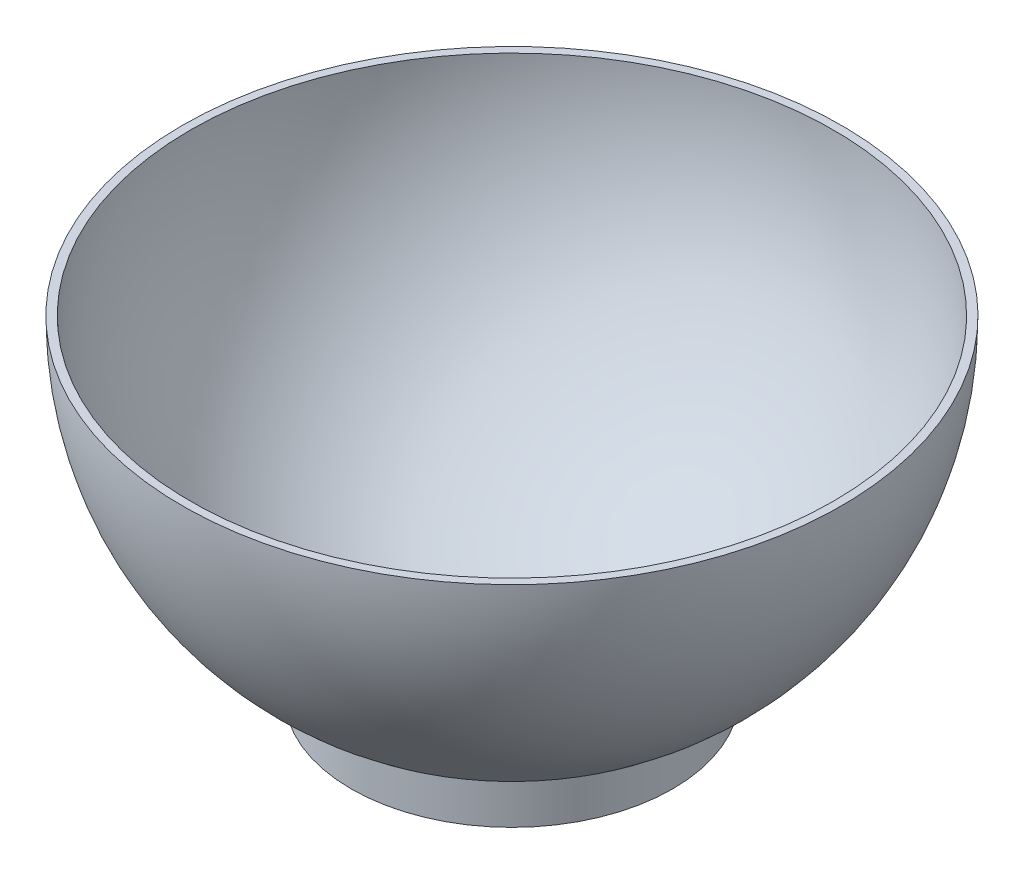
ISO-10303-21;
HEADER;
FILE_DESCRIPTION(('STEP AP214'),'2;1');
FILE_NAME('part.step','',(''),(''),'','','');
FILE_SCHEMA(('AUTOMOTIVE_DESIGN { 1 0 10303 214 1 1 1 1 }'));
ENDSEC;
DATA;
#1=APPLICATION_CONTEXT('core data for automotive mechanical design processes');
#2=APPLICATION_PROTOCOL_DEFINITION('international standard','automotive_design',2000,#1);
#3=PRODUCT_CONTEXT('',#1,'mechanical');
#4=PRODUCT('Part','Part','',(#3));
#5=PRODUCT_RELATED_PRODUCT_CATEGORY('part','',(#4));
#6=PRODUCT_DEFINITION_FORMATION('','',#4);
#7=PRODUCT_DEFINITION_CONTEXT('part definition',#1,'design');
#8=PRODUCT_DEFINITION('design','',#6,#7);
#9=PRODUCT_DEFINITION_SHAPE('','',#8);
#10=(LENGTH_UNIT() NAMED_UNIT(*) SI_UNIT(.MILLI.,.METRE.));
#11=(NAMED_UNIT(*) PLANE_ANGLE_UNIT() SI_UNIT($,.RADIAN.));
#12=(NAMED_UNIT(*) SI_UNIT($,.STERADIAN.) SOLID_ANGLE_UNIT());
#13=UNCERTAINTY_MEASURE_WITH_UNIT(LENGTH_MEASURE(1.E-05),#10,'distance_accuracy_value','');
#14=(GEOMETRIC_REPRESENTATION_CONTEXT(3) GLOBAL_UNCERTAINTY_ASSIGNED_CONTEXT((#13)) GLOBAL_UNIT_ASSIGNED_CONTEXT((#10,
#11,#12)) REPRESENTATION_CONTEXT('',''));
#15=CARTESIAN_POINT('',(0.,0.,0.));
#16=DIRECTION('',(0.,0.,1.));
#17=DIRECTION('',(1.,0.,0.));
#18=AXIS2_PLACEMENT_3D('',#15,#16,#17);
#19=CARTESIAN_POINT('',(0.,-3.17500000000002,0.));
#20=DIRECTION('',(0.,1.,0.));
#21=DIRECTION('',(-1.,0.,0.));
#22=AXIS2_PLACEMENT_3D('',#19,#20,#21);
#23=PLANE('',#22);
#24=CARTESIAN_POINT('',(0.,-3.17500000000001,0.));
#25=DIRECTION('',(0.,1.,0.));
#26=DIRECTION('',(-1.,0.,0.));
#27=AXIS2_PLACEMENT_3D('',#24,#25,#26);
#28=CIRCLE('',#27,63.5);
#29=CARTESIAN_POINT('',(-63.5,-3.17500000000002,0.));
#30=VERTEX_POINT('',#29);
#31=EDGE_CURVE('E10',#30,#30,#28,.T.);
#32=ORIENTED_EDGE('',*,*,#31,.F.);
#33=EDGE_LOOP('',(#32));
#34=FACE_BOUND('',#33,.T.);
#35=ADVANCED_FACE('F39',(#34),#23,.F.);
#36=CARTESIAN_POINT('',(0.,0.,0.));
#37=DIRECTION('',(0.,1.,0.));
#38=DIRECTION('',(-1.,0.,0.));
#39=AXIS2_PLACEMENT_3D('',#36,#37,#38);
#40=CYLINDRICAL_SURFACE('',#39,63.5);
#41=CARTESIAN_POINT('',(0.,13.3633834320996,0.));
#42=DIRECTION('',(0.,1.,0.));
#43=DIRECTION('',(-1.,0.,0.));
#44=AXIS2_PLACEMENT_3D('',#41,#42,#43);
#45=CIRCLE('',#44,63.5);
#46=CARTESIAN_POINT('',(-63.5,13.3633834320996,0.));
#47=VERTEX_POINT('',#46);
#48=EDGE_CURVE('E45',#47,#47,#45,.T.);
#49=ORIENTED_EDGE('',*,*,#48,.F.);
#50=EDGE_LOOP('',(#49));
#51=FACE_BOUND('',#50,.T.);
#52=ORIENTED_EDGE('',*,*,#31,.T.);
#53=EDGE_LOOP('',(#52));
#54=FACE_BOUND('',#53,.T.);
#55=ADVANCED_FACE('F71',(#51,#54),#40,.T.);
#56=CARTESIAN_POINT('',(0.,127.,0.));
#57=DIRECTION('',(0.,1.,0.));
#58=DIRECTION('',(1.,0.,0.));
#59=AXIS2_PLACEMENT_3D('',#56,#57,#58);
#60=SPHERICAL_SURFACE('',#59,130.175);
#61=CARTESIAN_POINT('',(0.,127.000000000001,0.));
#62=DIRECTION('',(0.,1.,0.));
#63=DIRECTION('',(-1.,0.,0.));
#64=AXIS2_PLACEMENT_3D('',#61,#62,#63);
#65=CIRCLE('',#64,130.175);
#66=CARTESIAN_POINT('',(-130.175,127.000000000001,0.));
#67=VERTEX_POINT('',#66);
#68=EDGE_CURVE('E49',#67,#67,#65,.T.);
#69=ORIENTED_EDGE('',*,*,#68,.F.);
#70=EDGE_LOOP('',(#69));
#71=FACE_BOUND('',#70,.T.);
#72=ORIENTED_EDGE('',*,*,#48,.T.);
#73=EDGE_LOOP('',(#72));
#74=FACE_BOUND('',#73,.T.);
#75=ADVANCED_FACE('F63',(#71,#74),#60,.T.);
#76=CARTESIAN_POINT('',(-4.55191440096146E-11,127.000000000001,0.));
#77=DIRECTION('',(0.,1.,0.));
#78=DIRECTION('',(-1.,0.,0.));
#79=AXIS2_PLACEMENT_3D('',#76,#77,#78);
#80=PLANE('',#79);
#81=ORIENTED_EDGE('',*,*,#68,.T.);
#82=EDGE_LOOP('',(#81));
#83=FACE_BOUND('',#82,.T.);
#84=CARTESIAN_POINT('',(0.,127.,0.));
#85=DIRECTION('',(0.,1.,0.));
#86=DIRECTION('',(-1.,0.,0.));
#87=AXIS2_PLACEMENT_3D('',#84,#85,#86);
#88=CIRCLE('',#87,127.);
#89=CARTESIAN_POINT('',(-127.,127.,0.));
#90=VERTEX_POINT('',#89);
#91=EDGE_CURVE('E53',#90,#90,#88,.T.);
#92=ORIENTED_EDGE('',*,*,#91,.F.);
#93=EDGE_LOOP('',(#92));
#94=FACE_BOUND('',#93,.T.);
#95=ADVANCED_FACE('F61',(#83,#94),#80,.T.);
#96=CARTESIAN_POINT('',(0.,127.,0.));
#97=DIRECTION('',(0.,1.,0.));
#98=DIRECTION('',(-1.,0.,0.));
#99=AXIS2_PLACEMENT_3D('',#96,#97,#98);
#100=SPHERICAL_SURFACE('',#99,127.);
#101=ORIENTED_EDGE('',*,*,#91,.T.);
#102=EDGE_LOOP('',(#101));
#103=FACE_BOUND('',#102,.T.);
#104=ADVANCED_FACE('F59',(#103),#100,.F.);
#105=CLOSED_SHELL('',(#35,#55,#75,#95,#104));
#106=MANIFOLD_SOLID_BREP('B2',#105);
#107=ADVANCED_BREP_SHAPE_REPRESENTATION('',(#18,#106),#14);
#108=SHAPE_DEFINITION_REPRESENTATION(#9,#107);
ENDSEC;
END-ISO-10303-21;
